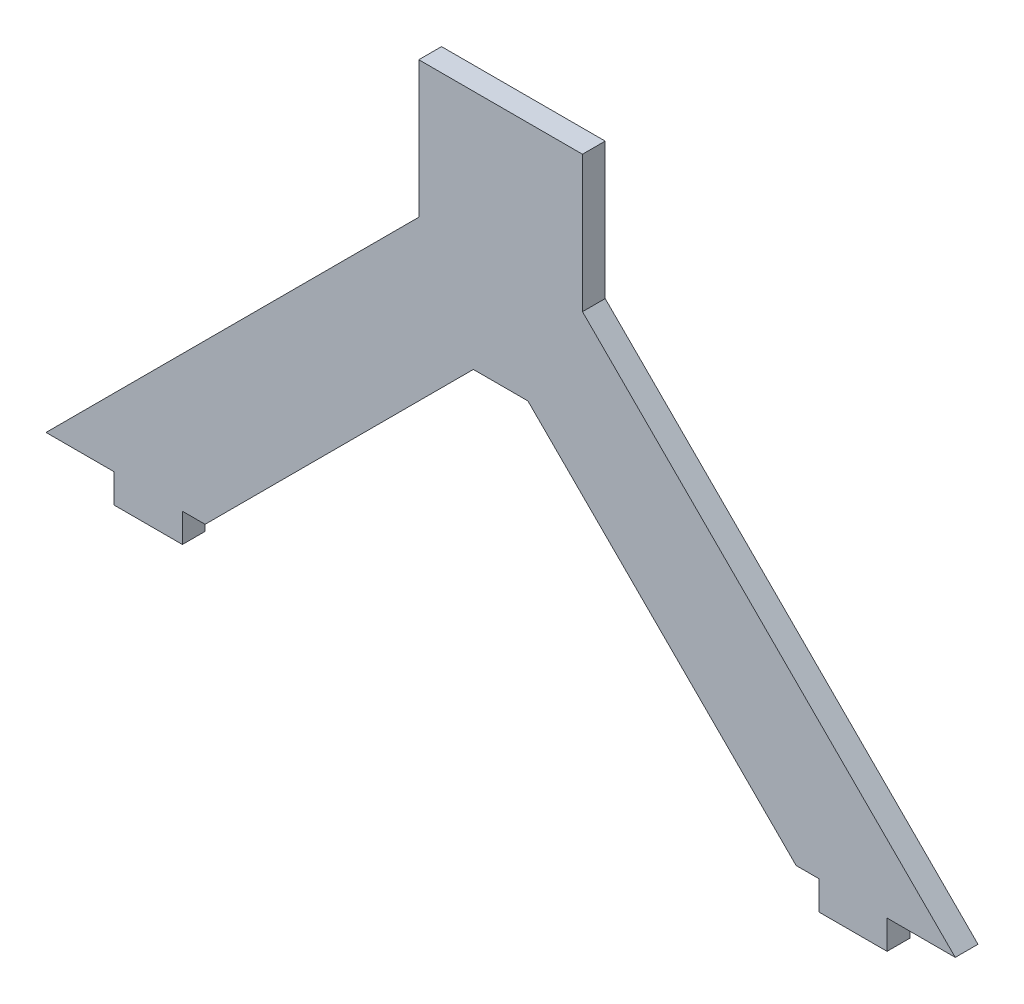
ISO-10303-21;
HEADER;
FILE_DESCRIPTION(('STEP AP214'),'2;1');
FILE_NAME('part.step','',(''),(''),'','','');
FILE_SCHEMA(('AUTOMOTIVE_DESIGN { 1 0 10303 214 1 1 1 1 }'));
ENDSEC;
DATA;
#1=APPLICATION_CONTEXT('core data for automotive mechanical design processes');
#2=APPLICATION_PROTOCOL_DEFINITION('international standard','automotive_design',2000,#1);
#3=PRODUCT_CONTEXT('',#1,'mechanical');
#4=PRODUCT('Part','Part','',(#3));
#5=PRODUCT_RELATED_PRODUCT_CATEGORY('part','',(#4));
#6=PRODUCT_DEFINITION_FORMATION('','',#4);
#7=PRODUCT_DEFINITION_CONTEXT('part definition',#1,'design');
#8=PRODUCT_DEFINITION('design','',#6,#7);
#9=PRODUCT_DEFINITION_SHAPE('','',#8);
#10=(LENGTH_UNIT() NAMED_UNIT(*) SI_UNIT(.MILLI.,.METRE.));
#11=(NAMED_UNIT(*) PLANE_ANGLE_UNIT() SI_UNIT($,.RADIAN.));
#12=(NAMED_UNIT(*) SI_UNIT($,.STERADIAN.) SOLID_ANGLE_UNIT());
#13=UNCERTAINTY_MEASURE_WITH_UNIT(LENGTH_MEASURE(1.E-05),#10,'distance_accuracy_value','');
#14=(GEOMETRIC_REPRESENTATION_CONTEXT(3) GLOBAL_UNCERTAINTY_ASSIGNED_CONTEXT((#13)) GLOBAL_UNIT_ASSIGNED_CONTEXT((#10,
#11,#12)) REPRESENTATION_CONTEXT('',''));
#15=CARTESIAN_POINT('',(0.,0.,0.));
#16=DIRECTION('',(0.,0.,1.));
#17=DIRECTION('',(1.,0.,0.));
#18=AXIS2_PLACEMENT_3D('',#15,#16,#17);
#19=CARTESIAN_POINT('',(30.,6.35,5.));
#20=DIRECTION('',(-1.,0.,0.));
#21=DIRECTION('',(0.,0.,1.));
#22=AXIS2_PLACEMENT_3D('',#19,#20,#21);
#23=PLANE('',#22);
#24=DIRECTION('',(0.,1.,0.));
#25=VECTOR('',#24,1.);
#26=CARTESIAN_POINT('',(30.,6.35,0.));
#27=LINE('',#26,#25);
#28=CARTESIAN_POINT('',(30.,0.,0.));
#29=VERTEX_POINT('',#28);
#30=CARTESIAN_POINT('',(30.,6.35,0.));
#31=VERTEX_POINT('',#30);
#32=EDGE_CURVE('E200',#29,#31,#27,.T.);
#33=ORIENTED_EDGE('',*,*,#32,.T.);
#34=DIRECTION('',(0.,0.,-1.));
#35=VECTOR('',#34,1.);
#36=CARTESIAN_POINT('',(30.,6.35,5.));
#37=LINE('',#36,#35);
#38=CARTESIAN_POINT('',(30.,6.35,5.));
#39=VERTEX_POINT('',#38);
#40=EDGE_CURVE('E11',#39,#31,#37,.T.);
#41=ORIENTED_EDGE('',*,*,#40,.F.);
#42=DIRECTION('',(0.,1.,0.));
#43=VECTOR('',#42,1.);
#44=CARTESIAN_POINT('',(30.,6.35,5.));
#45=LINE('',#44,#43);
#46=CARTESIAN_POINT('',(30.,0.,5.));
#47=VERTEX_POINT('',#46);
#48=EDGE_CURVE('E252',#47,#39,#45,.T.);
#49=ORIENTED_EDGE('',*,*,#48,.F.);
#50=DIRECTION('',(0.,0.,-1.));
#51=VECTOR('',#50,1.);
#52=CARTESIAN_POINT('',(30.,0.,5.));
#53=LINE('',#52,#51);
#54=EDGE_CURVE('E196',#47,#29,#53,.T.);
#55=ORIENTED_EDGE('',*,*,#54,.T.);
#56=EDGE_LOOP('',(#33,#41,#49,#55));
#57=FACE_BOUND('',#56,.T.);
#58=ADVANCED_FACE('F39',(#57),#23,.F.);
#59=CARTESIAN_POINT('',(35.,6.35,5.));
#60=DIRECTION('',(0.,1.,0.));
#61=DIRECTION('',(-1.,0.,0.));
#62=AXIS2_PLACEMENT_3D('',#59,#60,#61);
#63=PLANE('',#62);
#64=DIRECTION('',(1.,0.,0.));
#65=VECTOR('',#64,1.);
#66=CARTESIAN_POINT('',(35.,6.35,0.));
#67=LINE('',#66,#65);
#68=CARTESIAN_POINT('',(35.,6.35,0.));
#69=VERTEX_POINT('',#68);
#70=EDGE_CURVE('E204',#31,#69,#67,.T.);
#71=ORIENTED_EDGE('',*,*,#70,.T.);
#72=DIRECTION('',(0.,0.,-1.));
#73=VECTOR('',#72,1.);
#74=CARTESIAN_POINT('',(35.,6.35,5.));
#75=LINE('',#74,#73);
#76=CARTESIAN_POINT('',(35.,6.35,5.));
#77=VERTEX_POINT('',#76);
#78=EDGE_CURVE('E48',#77,#69,#75,.T.);
#79=ORIENTED_EDGE('',*,*,#78,.F.);
#80=DIRECTION('',(1.,0.,0.));
#81=VECTOR('',#80,1.);
#82=CARTESIAN_POINT('',(35.,6.35,5.));
#83=LINE('',#82,#81);
#84=EDGE_CURVE('E129',#39,#77,#83,.T.);
#85=ORIENTED_EDGE('',*,*,#84,.F.);
#86=ORIENTED_EDGE('',*,*,#40,.T.);
#87=EDGE_LOOP('',(#71,#79,#85,#86));
#88=FACE_BOUND('',#87,.T.);
#89=ADVANCED_FACE('F388',(#88),#63,.F.);
#90=CARTESIAN_POINT('',(94.,65.35,5.));
#91=DIRECTION('',(-0.707106781186547,0.707106781186548,0.));
#92=DIRECTION('',(-0.707106781186548,-0.707106781186547,0.));
#93=AXIS2_PLACEMENT_3D('',#90,#91,#92);
#94=PLANE('',#93);
#95=DIRECTION('',(0.707106781186548,0.707106781186547,0.));
#96=VECTOR('',#95,1.);
#97=CARTESIAN_POINT('',(94.,65.35,0.));
#98=LINE('',#97,#96);
#99=CARTESIAN_POINT('',(94.,65.35,0.));
#100=VERTEX_POINT('',#99);
#101=EDGE_CURVE('E207',#69,#100,#98,.T.);
#102=ORIENTED_EDGE('',*,*,#101,.T.);
#103=DIRECTION('',(0.,0.,-1.));
#104=VECTOR('',#103,1.);
#105=CARTESIAN_POINT('',(94.,65.35,5.));
#106=LINE('',#105,#104);
#107=CARTESIAN_POINT('',(94.,65.35,5.));
#108=VERTEX_POINT('',#107);
#109=EDGE_CURVE('E303',#108,#100,#106,.T.);
#110=ORIENTED_EDGE('',*,*,#109,.F.);
#111=DIRECTION('',(0.707106781186548,0.707106781186547,0.));
#112=VECTOR('',#111,1.);
#113=CARTESIAN_POINT('',(94.,65.35,5.));
#114=LINE('',#113,#112);
#115=EDGE_CURVE('E313',#77,#108,#114,.T.);
#116=ORIENTED_EDGE('',*,*,#115,.F.);
#117=ORIENTED_EDGE('',*,*,#78,.T.);
#118=EDGE_LOOP('',(#102,#110,#116,#117));
#119=FACE_BOUND('',#118,.T.);
#120=ADVANCED_FACE('F311',(#119),#94,.F.);
#121=CARTESIAN_POINT('',(94.,65.35,5.));
#122=DIRECTION('',(0.,1.,0.));
#123=DIRECTION('',(0.,0.,1.));
#124=AXIS2_PLACEMENT_3D('',#121,#122,#123);
#125=PLANE('',#124);
#126=DIRECTION('',(1.,0.,0.));
#127=VECTOR('',#126,1.);
#128=CARTESIAN_POINT('',(94.,65.35,0.));
#129=LINE('',#128,#127);
#130=CARTESIAN_POINT('',(106.,65.35,0.));
#131=VERTEX_POINT('',#130);
#132=EDGE_CURVE('E210',#100,#131,#129,.T.);
#133=ORIENTED_EDGE('',*,*,#132,.T.);
#134=DIRECTION('',(0.,0.,-1.));
#135=VECTOR('',#134,1.);
#136=CARTESIAN_POINT('',(106.,65.35,5.));
#137=LINE('',#136,#135);
#138=CARTESIAN_POINT('',(106.,65.35,5.));
#139=VERTEX_POINT('',#138);
#140=EDGE_CURVE('E299',#139,#131,#137,.T.);
#141=ORIENTED_EDGE('',*,*,#140,.F.);
#142=DIRECTION('',(1.,0.,0.));
#143=VECTOR('',#142,1.);
#144=CARTESIAN_POINT('',(94.,65.35,5.));
#145=LINE('',#144,#143);
#146=EDGE_CURVE('E332',#108,#139,#145,.T.);
#147=ORIENTED_EDGE('',*,*,#146,.F.);
#148=ORIENTED_EDGE('',*,*,#109,.T.);
#149=EDGE_LOOP('',(#133,#141,#147,#148));
#150=FACE_BOUND('',#149,.T.);
#151=ADVANCED_FACE('F322',(#150),#125,.F.);
#152=CARTESIAN_POINT('',(165.,6.35000000000002,5.));
#153=DIRECTION('',(0.707106781186548,0.707106781186548,0.));
#154=DIRECTION('',(-0.707106781186548,0.707106781186548,0.));
#155=AXIS2_PLACEMENT_3D('',#152,#153,#154);
#156=PLANE('',#155);
#157=DIRECTION('',(0.707106781186548,-0.707106781186548,0.));
#158=VECTOR('',#157,1.);
#159=CARTESIAN_POINT('',(165.,6.35000000000002,0.));
#160=LINE('',#159,#158);
#161=CARTESIAN_POINT('',(165.,6.35000000000002,0.));
#162=VERTEX_POINT('',#161);
#163=EDGE_CURVE('E213',#131,#162,#160,.T.);
#164=ORIENTED_EDGE('',*,*,#163,.T.);
#165=DIRECTION('',(0.,0.,-1.));
#166=VECTOR('',#165,1.);
#167=CARTESIAN_POINT('',(165.,6.35000000000002,5.));
#168=LINE('',#167,#166);
#169=CARTESIAN_POINT('',(165.,6.35000000000002,5.));
#170=VERTEX_POINT('',#169);
#171=EDGE_CURVE('E295',#170,#162,#168,.T.);
#172=ORIENTED_EDGE('',*,*,#171,.F.);
#173=DIRECTION('',(0.707106781186548,-0.707106781186548,0.));
#174=VECTOR('',#173,1.);
#175=CARTESIAN_POINT('',(165.,6.35000000000002,5.));
#176=LINE('',#175,#174);
#177=EDGE_CURVE('E328',#139,#170,#176,.T.);
#178=ORIENTED_EDGE('',*,*,#177,.F.);
#179=ORIENTED_EDGE('',*,*,#140,.T.);
#180=EDGE_LOOP('',(#164,#172,#178,#179));
#181=FACE_BOUND('',#180,.T.);
#182=ADVANCED_FACE('F326',(#181),#156,.F.);
#183=CARTESIAN_POINT('',(170.,6.35,5.));
#184=DIRECTION('',(0.,1.,0.));
#185=DIRECTION('',(-1.,0.,0.));
#186=AXIS2_PLACEMENT_3D('',#183,#184,#185);
#187=PLANE('',#186);
#188=DIRECTION('',(1.,0.,0.));
#189=VECTOR('',#188,1.);
#190=CARTESIAN_POINT('',(170.,6.35,0.));
#191=LINE('',#190,#189);
#192=CARTESIAN_POINT('',(170.,6.35,0.));
#193=VERTEX_POINT('',#192);
#194=EDGE_CURVE('E216',#162,#193,#191,.T.);
#195=ORIENTED_EDGE('',*,*,#194,.T.);
#196=DIRECTION('',(0.,0.,-1.));
#197=VECTOR('',#196,1.);
#198=CARTESIAN_POINT('',(170.,6.35,5.));
#199=LINE('',#198,#197);
#200=CARTESIAN_POINT('',(170.,6.35,5.));
#201=VERTEX_POINT('',#200);
#202=EDGE_CURVE('E291',#201,#193,#199,.T.);
#203=ORIENTED_EDGE('',*,*,#202,.F.);
#204=DIRECTION('',(1.,0.,0.));
#205=VECTOR('',#204,1.);
#206=CARTESIAN_POINT('',(170.,6.35,5.));
#207=LINE('',#206,#205);
#208=EDGE_CURVE('E331',#170,#201,#207,.T.);
#209=ORIENTED_EDGE('',*,*,#208,.F.);
#210=ORIENTED_EDGE('',*,*,#171,.T.);
#211=EDGE_LOOP('',(#195,#203,#209,#210));
#212=FACE_BOUND('',#211,.T.);
#213=ADVANCED_FACE('F401',(#212),#187,.F.);
#214=CARTESIAN_POINT('',(170.,0.,5.));
#215=DIRECTION('',(1.,0.,0.));
#216=DIRECTION('',(0.,0.,-1.));
#217=AXIS2_PLACEMENT_3D('',#214,#215,#216);
#218=PLANE('',#217);
#219=DIRECTION('',(0.,-1.,0.));
#220=VECTOR('',#219,1.);
#221=CARTESIAN_POINT('',(170.,0.,0.));
#222=LINE('',#221,#220);
#223=CARTESIAN_POINT('',(170.,0.,0.));
#224=VERTEX_POINT('',#223);
#225=EDGE_CURVE('E219',#193,#224,#222,.T.);
#226=ORIENTED_EDGE('',*,*,#225,.T.);
#227=DIRECTION('',(0.,0.,-1.));
#228=VECTOR('',#227,1.);
#229=CARTESIAN_POINT('',(170.,0.,5.));
#230=LINE('',#229,#228);
#231=CARTESIAN_POINT('',(170.,0.,5.));
#232=VERTEX_POINT('',#231);
#233=EDGE_CURVE('E287',#232,#224,#230,.T.);
#234=ORIENTED_EDGE('',*,*,#233,.F.);
#235=DIRECTION('',(0.,-1.,0.));
#236=VECTOR('',#235,1.);
#237=CARTESIAN_POINT('',(170.,0.,5.));
#238=LINE('',#237,#236);
#239=EDGE_CURVE('E336',#201,#232,#238,.T.);
#240=ORIENTED_EDGE('',*,*,#239,.F.);
#241=ORIENTED_EDGE('',*,*,#202,.T.);
#242=EDGE_LOOP('',(#226,#234,#240,#241));
#243=FACE_BOUND('',#242,.T.);
#244=ADVANCED_FACE('F404',(#243),#218,.F.);
#245=CARTESIAN_POINT('',(185.,0.,5.));
#246=DIRECTION('',(0.,1.,0.));
#247=DIRECTION('',(0.,0.,1.));
#248=AXIS2_PLACEMENT_3D('',#245,#246,#247);
#249=PLANE('',#248);
#250=DIRECTION('',(1.,0.,0.));
#251=VECTOR('',#250,1.);
#252=CARTESIAN_POINT('',(185.,0.,0.));
#253=LINE('',#252,#251);
#254=CARTESIAN_POINT('',(185.,0.,0.));
#255=VERTEX_POINT('',#254);
#256=EDGE_CURVE('E222',#224,#255,#253,.T.);
#257=ORIENTED_EDGE('',*,*,#256,.T.);
#258=DIRECTION('',(0.,0.,-1.));
#259=VECTOR('',#258,1.);
#260=CARTESIAN_POINT('',(185.,0.,5.));
#261=LINE('',#260,#259);
#262=CARTESIAN_POINT('',(185.,0.,5.));
#263=VERTEX_POINT('',#262);
#264=EDGE_CURVE('E283',#263,#255,#261,.T.);
#265=ORIENTED_EDGE('',*,*,#264,.F.);
#266=DIRECTION('',(1.,0.,0.));
#267=VECTOR('',#266,1.);
#268=CARTESIAN_POINT('',(185.,0.,5.));
#269=LINE('',#268,#267);
#270=EDGE_CURVE('E343',#232,#263,#269,.T.);
#271=ORIENTED_EDGE('',*,*,#270,.F.);
#272=ORIENTED_EDGE('',*,*,#233,.T.);
#273=EDGE_LOOP('',(#257,#265,#271,#272));
#274=FACE_BOUND('',#273,.T.);
#275=ADVANCED_FACE('F408',(#274),#249,.F.);
#276=CARTESIAN_POINT('',(185.,6.35,5.));
#277=DIRECTION('',(-1.,0.,0.));
#278=DIRECTION('',(0.,0.,1.));
#279=AXIS2_PLACEMENT_3D('',#276,#277,#278);
#280=PLANE('',#279);
#281=DIRECTION('',(0.,1.,0.));
#282=VECTOR('',#281,1.);
#283=CARTESIAN_POINT('',(185.,6.35,0.));
#284=LINE('',#283,#282);
#285=CARTESIAN_POINT('',(185.,6.35,0.));
#286=VERTEX_POINT('',#285);
#287=EDGE_CURVE('E225',#255,#286,#284,.T.);
#288=ORIENTED_EDGE('',*,*,#287,.T.);
#289=DIRECTION('',(0.,0.,-1.));
#290=VECTOR('',#289,1.);
#291=CARTESIAN_POINT('',(185.,6.35,5.));
#292=LINE('',#291,#290);
#293=CARTESIAN_POINT('',(185.,6.35,5.));
#294=VERTEX_POINT('',#293);
#295=EDGE_CURVE('E279',#294,#286,#292,.T.);
#296=ORIENTED_EDGE('',*,*,#295,.F.);
#297=DIRECTION('',(0.,1.,0.));
#298=VECTOR('',#297,1.);
#299=CARTESIAN_POINT('',(185.,6.35,5.));
#300=LINE('',#299,#298);
#301=EDGE_CURVE('E346',#263,#294,#300,.T.);
#302=ORIENTED_EDGE('',*,*,#301,.F.);
#303=ORIENTED_EDGE('',*,*,#264,.T.);
#304=EDGE_LOOP('',(#288,#296,#302,#303));
#305=FACE_BOUND('',#304,.T.);
#306=ADVANCED_FACE('F412',(#305),#280,.F.);
#307=CARTESIAN_POINT('',(200.,6.35,5.));
#308=DIRECTION('',(0.,1.,0.));
#309=DIRECTION('',(0.,0.,1.));
#310=AXIS2_PLACEMENT_3D('',#307,#308,#309);
#311=PLANE('',#310);
#312=DIRECTION('',(1.,0.,0.));
#313=VECTOR('',#312,1.);
#314=CARTESIAN_POINT('',(200.,6.35,0.));
#315=LINE('',#314,#313);
#316=CARTESIAN_POINT('',(200.,6.35,0.));
#317=VERTEX_POINT('',#316);
#318=EDGE_CURVE('E228',#286,#317,#315,.T.);
#319=ORIENTED_EDGE('',*,*,#318,.T.);
#320=DIRECTION('',(0.,0.,-1.));
#321=VECTOR('',#320,1.);
#322=CARTESIAN_POINT('',(200.,6.35,5.));
#323=LINE('',#322,#321);
#324=CARTESIAN_POINT('',(200.,6.35,5.));
#325=VERTEX_POINT('',#324);
#326=EDGE_CURVE('E275',#325,#317,#323,.T.);
#327=ORIENTED_EDGE('',*,*,#326,.F.);
#328=DIRECTION('',(1.,0.,0.));
#329=VECTOR('',#328,1.);
#330=CARTESIAN_POINT('',(200.,6.35,5.));
#331=LINE('',#330,#329);
#332=EDGE_CURVE('E349',#294,#325,#331,.T.);
#333=ORIENTED_EDGE('',*,*,#332,.F.);
#334=ORIENTED_EDGE('',*,*,#295,.T.);
#335=EDGE_LOOP('',(#319,#327,#333,#334));
#336=FACE_BOUND('',#335,.T.);
#337=ADVANCED_FACE('F416',(#336),#311,.F.);
#338=CARTESIAN_POINT('',(118.,88.35,5.));
#339=DIRECTION('',(-0.707106781186547,-0.707106781186548,0.));
#340=DIRECTION('',(0.707106781186548,-0.707106781186547,0.));
#341=AXIS2_PLACEMENT_3D('',#338,#339,#340);
#342=PLANE('',#341);
#343=DIRECTION('',(-0.707106781186548,0.707106781186547,0.));
#344=VECTOR('',#343,1.);
#345=CARTESIAN_POINT('',(118.,88.35,0.));
#346=LINE('',#345,#344);
#347=CARTESIAN_POINT('',(118.,88.35,0.));
#348=VERTEX_POINT('',#347);
#349=EDGE_CURVE('E231',#317,#348,#346,.T.);
#350=ORIENTED_EDGE('',*,*,#349,.T.);
#351=DIRECTION('',(0.,0.,-1.));
#352=VECTOR('',#351,1.);
#353=CARTESIAN_POINT('',(118.,88.35,5.));
#354=LINE('',#353,#352);
#355=CARTESIAN_POINT('',(118.,88.35,5.));
#356=VERTEX_POINT('',#355);
#357=EDGE_CURVE('E271',#356,#348,#354,.T.);
#358=ORIENTED_EDGE('',*,*,#357,.F.);
#359=DIRECTION('',(-0.707106781186548,0.707106781186547,0.));
#360=VECTOR('',#359,1.);
#361=CARTESIAN_POINT('',(118.,88.35,5.));
#362=LINE('',#361,#360);
#363=EDGE_CURVE('E352',#325,#356,#362,.T.);
#364=ORIENTED_EDGE('',*,*,#363,.F.);
#365=ORIENTED_EDGE('',*,*,#326,.T.);
#366=EDGE_LOOP('',(#350,#358,#364,#365));
#367=FACE_BOUND('',#366,.T.);
#368=ADVANCED_FACE('F420',(#367),#342,.F.);
#369=CARTESIAN_POINT('',(118.,88.35,5.));
#370=DIRECTION('',(-1.,0.,0.));
#371=DIRECTION('',(0.,0.,1.));
#372=AXIS2_PLACEMENT_3D('',#369,#370,#371);
#373=PLANE('',#372);
#374=DIRECTION('',(0.,1.,0.));
#375=VECTOR('',#374,1.);
#376=CARTESIAN_POINT('',(118.,88.35,0.));
#377=LINE('',#376,#375);
#378=CARTESIAN_POINT('',(118.,118.35,0.));
#379=VERTEX_POINT('',#378);
#380=EDGE_CURVE('E234',#348,#379,#377,.T.);
#381=ORIENTED_EDGE('',*,*,#380,.T.);
#382=DIRECTION('',(0.,0.,-1.));
#383=VECTOR('',#382,1.);
#384=CARTESIAN_POINT('',(118.,118.35,5.));
#385=LINE('',#384,#383);
#386=CARTESIAN_POINT('',(118.,118.35,5.));
#387=VERTEX_POINT('',#386);
#388=EDGE_CURVE('E267',#387,#379,#385,.T.);
#389=ORIENTED_EDGE('',*,*,#388,.F.);
#390=DIRECTION('',(0.,1.,0.));
#391=VECTOR('',#390,1.);
#392=CARTESIAN_POINT('',(118.,88.35,5.));
#393=LINE('',#392,#391);
#394=EDGE_CURVE('E355',#356,#387,#393,.T.);
#395=ORIENTED_EDGE('',*,*,#394,.F.);
#396=ORIENTED_EDGE('',*,*,#357,.T.);
#397=EDGE_LOOP('',(#381,#389,#395,#396));
#398=FACE_BOUND('',#397,.T.);
#399=ADVANCED_FACE('F424',(#398),#373,.F.);
#400=CARTESIAN_POINT('',(118.,118.35,5.));
#401=DIRECTION('',(0.,-1.,0.));
#402=DIRECTION('',(1.,0.,0.));
#403=AXIS2_PLACEMENT_3D('',#400,#401,#402);
#404=PLANE('',#403);
#405=DIRECTION('',(-1.,0.,0.));
#406=VECTOR('',#405,1.);
#407=CARTESIAN_POINT('',(118.,118.35,0.));
#408=LINE('',#407,#406);
#409=CARTESIAN_POINT('',(82.,118.35,0.));
#410=VERTEX_POINT('',#409);
#411=EDGE_CURVE('E237',#379,#410,#408,.T.);
#412=ORIENTED_EDGE('',*,*,#411,.T.);
#413=DIRECTION('',(0.,0.,-1.));
#414=VECTOR('',#413,1.);
#415=CARTESIAN_POINT('',(82.,118.35,5.));
#416=LINE('',#415,#414);
#417=CARTESIAN_POINT('',(82.,118.35,5.));
#418=VERTEX_POINT('',#417);
#419=EDGE_CURVE('E263',#418,#410,#416,.T.);
#420=ORIENTED_EDGE('',*,*,#419,.F.);
#421=DIRECTION('',(-1.,0.,0.));
#422=VECTOR('',#421,1.);
#423=CARTESIAN_POINT('',(118.,118.35,5.));
#424=LINE('',#423,#422);
#425=EDGE_CURVE('E358',#387,#418,#424,.T.);
#426=ORIENTED_EDGE('',*,*,#425,.F.);
#427=ORIENTED_EDGE('',*,*,#388,.T.);
#428=EDGE_LOOP('',(#412,#420,#426,#427));
#429=FACE_BOUND('',#428,.T.);
#430=ADVANCED_FACE('F428',(#429),#404,.F.);
#431=CARTESIAN_POINT('',(82.,118.35,5.));
#432=DIRECTION('',(1.,0.,0.));
#433=DIRECTION('',(0.,0.,-1.));
#434=AXIS2_PLACEMENT_3D('',#431,#432,#433);
#435=PLANE('',#434);
#436=DIRECTION('',(0.,-1.,0.));
#437=VECTOR('',#436,1.);
#438=CARTESIAN_POINT('',(82.,118.35,0.));
#439=LINE('',#438,#437);
#440=CARTESIAN_POINT('',(82.,88.3500000000001,0.));
#441=VERTEX_POINT('',#440);
#442=EDGE_CURVE('E240',#410,#441,#439,.T.);
#443=ORIENTED_EDGE('',*,*,#442,.T.);
#444=DIRECTION('',(0.,0.,-1.));
#445=VECTOR('',#444,1.);
#446=CARTESIAN_POINT('',(82.,88.3500000000001,5.));
#447=LINE('',#446,#445);
#448=CARTESIAN_POINT('',(82.,88.3500000000001,5.));
#449=VERTEX_POINT('',#448);
#450=EDGE_CURVE('E259',#449,#441,#447,.T.);
#451=ORIENTED_EDGE('',*,*,#450,.F.);
#452=DIRECTION('',(0.,-1.,0.));
#453=VECTOR('',#452,1.);
#454=CARTESIAN_POINT('',(82.,118.35,5.));
#455=LINE('',#454,#453);
#456=EDGE_CURVE('E361',#418,#449,#455,.T.);
#457=ORIENTED_EDGE('',*,*,#456,.F.);
#458=ORIENTED_EDGE('',*,*,#419,.T.);
#459=EDGE_LOOP('',(#443,#451,#457,#458));
#460=FACE_BOUND('',#459,.T.);
#461=ADVANCED_FACE('F369',(#460),#435,.F.);
#462=CARTESIAN_POINT('',(0.,6.35,5.));
#463=DIRECTION('',(0.707106781186548,-0.707106781186547,0.));
#464=DIRECTION('',(0.707106781186547,0.707106781186548,0.));
#465=AXIS2_PLACEMENT_3D('',#462,#463,#464);
#466=PLANE('',#465);
#467=DIRECTION('',(-0.707106781186547,-0.707106781186548,0.));
#468=VECTOR('',#467,1.);
#469=CARTESIAN_POINT('',(0.,6.35,0.));
#470=LINE('',#469,#468);
#471=CARTESIAN_POINT('',(0.,6.35,0.));
#472=VERTEX_POINT('',#471);
#473=EDGE_CURVE('E243',#441,#472,#470,.T.);
#474=ORIENTED_EDGE('',*,*,#473,.T.);
#475=DIRECTION('',(0.,0.,-1.));
#476=VECTOR('',#475,1.);
#477=CARTESIAN_POINT('',(0.,6.35,5.));
#478=LINE('',#477,#476);
#479=CARTESIAN_POINT('',(0.,6.35,5.));
#480=VERTEX_POINT('',#479);
#481=EDGE_CURVE('E189',#480,#472,#478,.T.);
#482=ORIENTED_EDGE('',*,*,#481,.F.);
#483=DIRECTION('',(-0.707106781186547,-0.707106781186548,0.));
#484=VECTOR('',#483,1.);
#485=CARTESIAN_POINT('',(0.,6.35,5.));
#486=LINE('',#485,#484);
#487=EDGE_CURVE('E178',#449,#480,#486,.T.);
#488=ORIENTED_EDGE('',*,*,#487,.F.);
#489=ORIENTED_EDGE('',*,*,#450,.T.);
#490=EDGE_LOOP('',(#474,#482,#488,#489));
#491=FACE_BOUND('',#490,.T.);
#492=ADVANCED_FACE('F373',(#491),#466,.F.);
#493=CARTESIAN_POINT('',(15.,6.35,5.));
#494=DIRECTION('',(0.,1.,0.));
#495=DIRECTION('',(0.,0.,1.));
#496=AXIS2_PLACEMENT_3D('',#493,#494,#495);
#497=PLANE('',#496);
#498=DIRECTION('',(1.,0.,0.));
#499=VECTOR('',#498,1.);
#500=CARTESIAN_POINT('',(15.,6.35,0.));
#501=LINE('',#500,#499);
#502=CARTESIAN_POINT('',(15.,6.35,0.));
#503=VERTEX_POINT('',#502);
#504=EDGE_CURVE('E187',#472,#503,#501,.T.);
#505=ORIENTED_EDGE('',*,*,#504,.T.);
#506=DIRECTION('',(0.,0.,-1.));
#507=VECTOR('',#506,1.);
#508=CARTESIAN_POINT('',(15.,6.35,5.));
#509=LINE('',#508,#507);
#510=CARTESIAN_POINT('',(15.,6.35,5.));
#511=VERTEX_POINT('',#510);
#512=EDGE_CURVE('E184',#511,#503,#509,.T.);
#513=ORIENTED_EDGE('',*,*,#512,.F.);
#514=DIRECTION('',(1.,0.,0.));
#515=VECTOR('',#514,1.);
#516=CARTESIAN_POINT('',(15.,6.35,5.));
#517=LINE('',#516,#515);
#518=EDGE_CURVE('E172',#480,#511,#517,.T.);
#519=ORIENTED_EDGE('',*,*,#518,.F.);
#520=ORIENTED_EDGE('',*,*,#481,.T.);
#521=EDGE_LOOP('',(#505,#513,#519,#520));
#522=FACE_BOUND('',#521,.T.);
#523=ADVANCED_FACE('F185',(#522),#497,.F.);
#524=CARTESIAN_POINT('',(15.,0.,5.));
#525=DIRECTION('',(1.,0.,0.));
#526=DIRECTION('',(0.,0.,-1.));
#527=AXIS2_PLACEMENT_3D('',#524,#525,#526);
#528=PLANE('',#527);
#529=DIRECTION('',(0.,-1.,0.));
#530=VECTOR('',#529,1.);
#531=CARTESIAN_POINT('',(15.,0.,0.));
#532=LINE('',#531,#530);
#533=CARTESIAN_POINT('',(15.,0.,0.));
#534=VERTEX_POINT('',#533);
#535=EDGE_CURVE('E115',#503,#534,#532,.T.);
#536=ORIENTED_EDGE('',*,*,#535,.T.);
#537=DIRECTION('',(0.,0.,-1.));
#538=VECTOR('',#537,1.);
#539=CARTESIAN_POINT('',(15.,0.,5.));
#540=LINE('',#539,#538);
#541=CARTESIAN_POINT('',(15.,0.,5.));
#542=VERTEX_POINT('',#541);
#543=EDGE_CURVE('E190',#542,#534,#540,.T.);
#544=ORIENTED_EDGE('',*,*,#543,.F.);
#545=DIRECTION('',(0.,-1.,0.));
#546=VECTOR('',#545,1.);
#547=CARTESIAN_POINT('',(15.,0.,5.));
#548=LINE('',#547,#546);
#549=EDGE_CURVE('E176',#511,#542,#548,.T.);
#550=ORIENTED_EDGE('',*,*,#549,.F.);
#551=ORIENTED_EDGE('',*,*,#512,.T.);
#552=EDGE_LOOP('',(#536,#544,#550,#551));
#553=FACE_BOUND('',#552,.T.);
#554=ADVANCED_FACE('F192',(#553),#528,.F.);
#555=CARTESIAN_POINT('',(30.,0.,5.));
#556=DIRECTION('',(0.,1.,0.));
#557=DIRECTION('',(0.,0.,1.));
#558=AXIS2_PLACEMENT_3D('',#555,#556,#557);
#559=PLANE('',#558);
#560=DIRECTION('',(1.,0.,0.));
#561=VECTOR('',#560,1.);
#562=CARTESIAN_POINT('',(30.,0.,0.));
#563=LINE('',#562,#561);
#564=EDGE_CURVE('E121',#534,#29,#563,.T.);
#565=ORIENTED_EDGE('',*,*,#564,.T.);
#566=ORIENTED_EDGE('',*,*,#54,.F.);
#567=DIRECTION('',(1.,0.,0.));
#568=VECTOR('',#567,1.);
#569=CARTESIAN_POINT('',(30.,0.,5.));
#570=LINE('',#569,#568);
#571=EDGE_CURVE('E56',#542,#47,#570,.T.);
#572=ORIENTED_EDGE('',*,*,#571,.F.);
#573=ORIENTED_EDGE('',*,*,#543,.T.);
#574=EDGE_LOOP('',(#565,#566,#572,#573));
#575=FACE_BOUND('',#574,.T.);
#576=ADVANCED_FACE('F377',(#575),#559,.F.);
#577=CARTESIAN_POINT('',(0.,0.,5.));
#578=DIRECTION('',(0.,0.,-1.));
#579=DIRECTION('',(-1.,0.,0.));
#580=AXIS2_PLACEMENT_3D('',#577,#578,#579);
#581=PLANE('',#580);
#582=ORIENTED_EDGE('',*,*,#48,.T.);
#583=ORIENTED_EDGE('',*,*,#84,.T.);
#584=ORIENTED_EDGE('',*,*,#115,.T.);
#585=ORIENTED_EDGE('',*,*,#146,.T.);
#586=ORIENTED_EDGE('',*,*,#177,.T.);
#587=ORIENTED_EDGE('',*,*,#208,.T.);
#588=ORIENTED_EDGE('',*,*,#239,.T.);
#589=ORIENTED_EDGE('',*,*,#270,.T.);
#590=ORIENTED_EDGE('',*,*,#301,.T.);
#591=ORIENTED_EDGE('',*,*,#332,.T.);
#592=ORIENTED_EDGE('',*,*,#363,.T.);
#593=ORIENTED_EDGE('',*,*,#394,.T.);
#594=ORIENTED_EDGE('',*,*,#425,.T.);
#595=ORIENTED_EDGE('',*,*,#456,.T.);
#596=ORIENTED_EDGE('',*,*,#487,.T.);
#597=ORIENTED_EDGE('',*,*,#518,.T.);
#598=ORIENTED_EDGE('',*,*,#549,.T.);
#599=ORIENTED_EDGE('',*,*,#571,.T.);
#600=EDGE_LOOP('',(#582,#583,#584,#585,#586,#587,#588,#589,#590,#591,#592,#593,#594,#595,#596,
#597,#598,#599));
#601=FACE_BOUND('',#600,.T.);
#602=ADVANCED_FACE('F174',(#601),#581,.F.);
#603=CARTESIAN_POINT('',(0.,0.,0.));
#604=DIRECTION('',(0.,0.,-1.));
#605=DIRECTION('',(-1.,0.,0.));
#606=AXIS2_PLACEMENT_3D('',#603,#604,#605);
#607=PLANE('',#606);
#608=ORIENTED_EDGE('',*,*,#32,.F.);
#609=ORIENTED_EDGE('',*,*,#564,.F.);
#610=ORIENTED_EDGE('',*,*,#535,.F.);
#611=ORIENTED_EDGE('',*,*,#504,.F.);
#612=ORIENTED_EDGE('',*,*,#473,.F.);
#613=ORIENTED_EDGE('',*,*,#442,.F.);
#614=ORIENTED_EDGE('',*,*,#411,.F.);
#615=ORIENTED_EDGE('',*,*,#380,.F.);
#616=ORIENTED_EDGE('',*,*,#349,.F.);
#617=ORIENTED_EDGE('',*,*,#318,.F.);
#618=ORIENTED_EDGE('',*,*,#287,.F.);
#619=ORIENTED_EDGE('',*,*,#256,.F.);
#620=ORIENTED_EDGE('',*,*,#225,.F.);
#621=ORIENTED_EDGE('',*,*,#194,.F.);
#622=ORIENTED_EDGE('',*,*,#163,.F.);
#623=ORIENTED_EDGE('',*,*,#132,.F.);
#624=ORIENTED_EDGE('',*,*,#101,.F.);
#625=ORIENTED_EDGE('',*,*,#70,.F.);
#626=EDGE_LOOP('',(#608,#609,#610,#611,#612,#613,#614,#615,#616,#617,#618,#619,#620,#621,#622,
#623,#624,#625));
#627=FACE_BOUND('',#626,.T.);
#628=ADVANCED_FACE('F317',(#627),#607,.T.);
#629=CLOSED_SHELL('',(#58,#89,#120,#151,#182,#213,#244,#275,#306,#337,#368,#399,#430,#461,#492,
#523,#554,#576,#602,#628));
#630=MANIFOLD_SOLID_BREP('B2',#629);
#631=ADVANCED_BREP_SHAPE_REPRESENTATION('',(#18,#630),#14);
#632=SHAPE_DEFINITION_REPRESENTATION(#9,#631);
ENDSEC;
END-ISO-10303-21;
